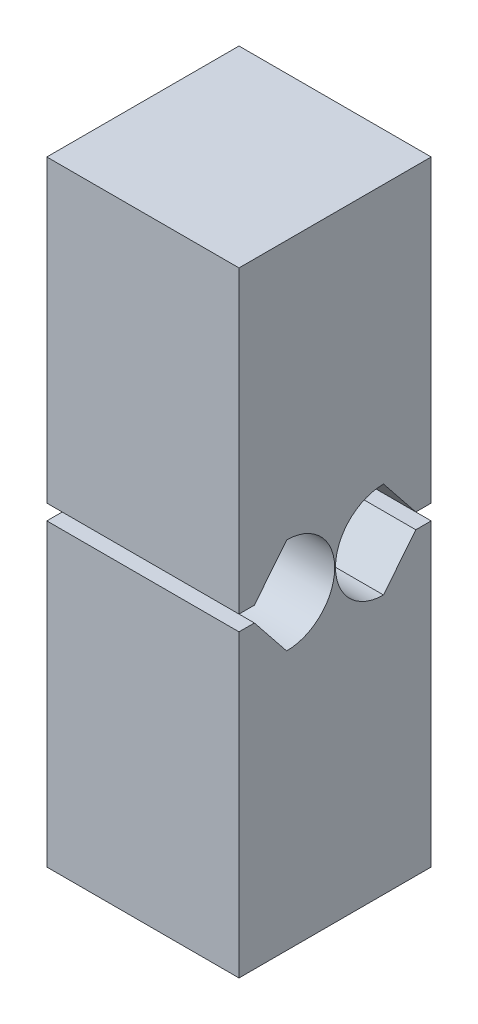
ISO-10303-21;
HEADER;
FILE_DESCRIPTION(('STEP AP214'),'2;1');
FILE_NAME('part.step','',(''),(''),'','','');
FILE_SCHEMA(('AUTOMOTIVE_DESIGN { 1 0 10303 214 1 1 1 1 }'));
ENDSEC;
DATA;
#1=APPLICATION_CONTEXT('core data for automotive mechanical design processes');
#2=APPLICATION_PROTOCOL_DEFINITION('international standard','automotive_design',2000,#1);
#3=PRODUCT_CONTEXT('',#1,'mechanical');
#4=PRODUCT('Part','Part','',(#3));
#5=PRODUCT_RELATED_PRODUCT_CATEGORY('part','',(#4));
#6=PRODUCT_DEFINITION_FORMATION('','',#4);
#7=PRODUCT_DEFINITION_CONTEXT('part definition',#1,'design');
#8=PRODUCT_DEFINITION('design','',#6,#7);
#9=PRODUCT_DEFINITION_SHAPE('','',#8);
#10=(LENGTH_UNIT() NAMED_UNIT(*) SI_UNIT(.MILLI.,.METRE.));
#11=(NAMED_UNIT(*) PLANE_ANGLE_UNIT() SI_UNIT($,.RADIAN.));
#12=(NAMED_UNIT(*) SI_UNIT($,.STERADIAN.) SOLID_ANGLE_UNIT());
#13=UNCERTAINTY_MEASURE_WITH_UNIT(LENGTH_MEASURE(1.E-05),#10,'distance_accuracy_value','');
#14=(GEOMETRIC_REPRESENTATION_CONTEXT(3) GLOBAL_UNCERTAINTY_ASSIGNED_CONTEXT((#13)) GLOBAL_UNIT_ASSIGNED_CONTEXT((#10,
#11,#12)) REPRESENTATION_CONTEXT('',''));
#15=CARTESIAN_POINT('',(0.,0.,0.));
#16=DIRECTION('',(0.,0.,1.));
#17=DIRECTION('',(1.,0.,0.));
#18=AXIS2_PLACEMENT_3D('',#15,#16,#17);
#19=CARTESIAN_POINT('',(-3.175,10.16,-3.175));
#20=DIRECTION('',(1.,0.,0.));
#21=DIRECTION('',(0.,0.,-1.));
#22=AXIS2_PLACEMENT_3D('',#19,#20,#21);
#23=PLANE('',#22);
#24=DIRECTION('',(0.,0.,1.));
#25=VECTOR('',#24,1.);
#26=CARTESIAN_POINT('',(-3.175,0.254,-3.175));
#27=LINE('',#26,#25);
#28=CARTESIAN_POINT('',(-3.175,0.254000000000001,-3.175));
#29=VERTEX_POINT('',#28);
#30=CARTESIAN_POINT('',(-3.175,0.254,-2.667));
#31=VERTEX_POINT('',#30);
#32=EDGE_CURVE('E151',#29,#31,#27,.T.);
#33=ORIENTED_EDGE('',*,*,#32,.T.);
#34=DIRECTION('',(0.,0.78086880944303,0.624695047554424));
#35=VECTOR('',#34,1.);
#36=CARTESIAN_POINT('',(-3.175,0.254,-2.667));
#37=LINE('',#36,#35);
#38=CARTESIAN_POINT('',(-3.175,1.5875,-1.6002));
#39=VERTEX_POINT('',#38);
#40=EDGE_CURVE('E163',#31,#39,#37,.T.);
#41=ORIENTED_EDGE('',*,*,#40,.T.);
#42=CARTESIAN_POINT('',(-3.175,0.,-1.6002));
#43=DIRECTION('',(1.,0.,0.));
#44=DIRECTION('',(0.,0.,-1.));
#45=AXIS2_PLACEMENT_3D('',#42,#43,#44);
#46=CIRCLE('',#45,1.5875);
#47=CARTESIAN_POINT('',(-3.175,-1.5875,-1.6002));
#48=VERTEX_POINT('',#47);
#49=EDGE_CURVE('E332',#39,#48,#46,.T.);
#50=ORIENTED_EDGE('',*,*,#49,.T.);
#51=DIRECTION('',(0.,0.78086880944303,-0.624695047554424));
#52=VECTOR('',#51,1.);
#53=CARTESIAN_POINT('',(-3.175,-0.254,-2.667));
#54=LINE('',#53,#52);
#55=CARTESIAN_POINT('',(-3.175,-0.254,-2.667));
#56=VERTEX_POINT('',#55);
#57=EDGE_CURVE('E299',#48,#56,#54,.T.);
#58=ORIENTED_EDGE('',*,*,#57,.T.);
#59=DIRECTION('',(0.,0.,-1.));
#60=VECTOR('',#59,1.);
#61=CARTESIAN_POINT('',(-3.175,-0.254,-3.175));
#62=LINE('',#61,#60);
#63=CARTESIAN_POINT('',(-3.175,-0.254000000000001,-3.175));
#64=VERTEX_POINT('',#63);
#65=EDGE_CURVE('E336',#56,#64,#62,.T.);
#66=ORIENTED_EDGE('',*,*,#65,.T.);
#67=DIRECTION('',(0.,-1.,0.));
#68=VECTOR('',#67,1.);
#69=CARTESIAN_POINT('',(-3.175,10.16,-3.175));
#70=LINE('',#69,#68);
#71=CARTESIAN_POINT('',(-3.175,-10.16,-3.175));
#72=VERTEX_POINT('',#71);
#73=EDGE_CURVE('E182',#64,#72,#70,.T.);
#74=ORIENTED_EDGE('',*,*,#73,.T.);
#75=DIRECTION('',(0.,0.,1.));
#76=VECTOR('',#75,1.);
#77=CARTESIAN_POINT('',(-3.175,-10.16,-3.175));
#78=LINE('',#77,#76);
#79=CARTESIAN_POINT('',(-3.175,-10.16,3.175));
#80=VERTEX_POINT('',#79);
#81=EDGE_CURVE('E229',#72,#80,#78,.T.);
#82=ORIENTED_EDGE('',*,*,#81,.T.);
#83=DIRECTION('',(0.,-1.,0.));
#84=VECTOR('',#83,1.);
#85=CARTESIAN_POINT('',(-3.175,10.16,3.175));
#86=LINE('',#85,#84);
#87=CARTESIAN_POINT('',(-3.175,-0.254,3.175));
#88=VERTEX_POINT('',#87);
#89=EDGE_CURVE('E46',#88,#80,#86,.T.);
#90=ORIENTED_EDGE('',*,*,#89,.F.);
#91=DIRECTION('',(0.,0.,1.));
#92=VECTOR('',#91,1.);
#93=CARTESIAN_POINT('',(-3.175,-0.254,3.175));
#94=LINE('',#93,#92);
#95=CARTESIAN_POINT('',(-3.175,-0.254,2.667));
#96=VERTEX_POINT('',#95);
#97=EDGE_CURVE('E285',#96,#88,#94,.T.);
#98=ORIENTED_EDGE('',*,*,#97,.F.);
#99=DIRECTION('',(0.,0.78086880944303,0.624695047554424));
#100=VECTOR('',#99,1.);
#101=CARTESIAN_POINT('',(-3.175,-0.254,2.667));
#102=LINE('',#101,#100);
#103=CARTESIAN_POINT('',(-3.175,-1.5875,1.6002));
#104=VERTEX_POINT('',#103);
#105=EDGE_CURVE('E287',#104,#96,#102,.T.);
#106=ORIENTED_EDGE('',*,*,#105,.F.);
#107=CARTESIAN_POINT('',(-3.175,0.,1.6002));
#108=DIRECTION('',(1.,0.,0.));
#109=DIRECTION('',(0.,0.,-1.));
#110=AXIS2_PLACEMENT_3D('',#107,#108,#109);
#111=CIRCLE('',#110,1.5875);
#112=CARTESIAN_POINT('',(-3.175,1.5875,1.6002));
#113=VERTEX_POINT('',#112);
#114=EDGE_CURVE('E291',#113,#104,#111,.F.);
#115=ORIENTED_EDGE('',*,*,#114,.F.);
#116=DIRECTION('',(0.,0.78086880944303,-0.624695047554424));
#117=VECTOR('',#116,1.);
#118=CARTESIAN_POINT('',(-3.175,0.254,2.667));
#119=LINE('',#118,#117);
#120=CARTESIAN_POINT('',(-3.175,0.254,2.667));
#121=VERTEX_POINT('',#120);
#122=EDGE_CURVE('E239',#121,#113,#119,.T.);
#123=ORIENTED_EDGE('',*,*,#122,.F.);
#124=DIRECTION('',(0.,0.,-1.));
#125=VECTOR('',#124,1.);
#126=CARTESIAN_POINT('',(-3.175,0.254,3.175));
#127=LINE('',#126,#125);
#128=CARTESIAN_POINT('',(-3.175,0.254,3.175));
#129=VERTEX_POINT('',#128);
#130=EDGE_CURVE('E295',#129,#121,#127,.T.);
#131=ORIENTED_EDGE('',*,*,#130,.F.);
#132=CARTESIAN_POINT('',(-3.175,10.16,3.175));
#133=VERTEX_POINT('',#132);
#134=EDGE_CURVE('E11',#133,#129,#86,.T.);
#135=ORIENTED_EDGE('',*,*,#134,.F.);
#136=DIRECTION('',(0.,0.,1.));
#137=VECTOR('',#136,1.);
#138=CARTESIAN_POINT('',(-3.175,10.16,-3.175));
#139=LINE('',#138,#137);
#140=CARTESIAN_POINT('',(-3.175,10.16,-3.175));
#141=VERTEX_POINT('',#140);
#142=EDGE_CURVE('E179',#141,#133,#139,.T.);
#143=ORIENTED_EDGE('',*,*,#142,.F.);
#144=EDGE_CURVE('E170',#141,#29,#70,.T.);
#145=ORIENTED_EDGE('',*,*,#144,.T.);
#146=EDGE_LOOP('',(#33,#41,#50,#58,#66,#74,#82,#90,#98,#106,#115,#123,#131,#135,#143,#145));
#147=FACE_BOUND('',#146,.T.);
#148=ADVANCED_FACE('F38',(#147),#23,.F.);
#149=CARTESIAN_POINT('',(3.175,10.16,-3.175));
#150=DIRECTION('',(-1.,0.,0.));
#151=DIRECTION('',(0.,0.,1.));
#152=AXIS2_PLACEMENT_3D('',#149,#150,#151);
#153=PLANE('',#152);
#154=DIRECTION('',(0.,0.,-1.));
#155=VECTOR('',#154,1.);
#156=CARTESIAN_POINT('',(3.175,0.254,-3.175));
#157=LINE('',#156,#155);
#158=CARTESIAN_POINT('',(3.175,0.254,-2.667));
#159=VERTEX_POINT('',#158);
#160=CARTESIAN_POINT('',(3.175,0.254,-3.175));
#161=VERTEX_POINT('',#160);
#162=EDGE_CURVE('E320',#159,#161,#157,.T.);
#163=ORIENTED_EDGE('',*,*,#162,.T.);
#164=DIRECTION('',(0.,-1.,0.));
#165=VECTOR('',#164,1.);
#166=CARTESIAN_POINT('',(3.175,10.16,-3.175));
#167=LINE('',#166,#165);
#168=CARTESIAN_POINT('',(3.175,10.16,-3.175));
#169=VERTEX_POINT('',#168);
#170=EDGE_CURVE('E173',#169,#161,#167,.T.);
#171=ORIENTED_EDGE('',*,*,#170,.F.);
#172=DIRECTION('',(0.,0.,-1.));
#173=VECTOR('',#172,1.);
#174=CARTESIAN_POINT('',(3.175,10.16,-3.175));
#175=LINE('',#174,#173);
#176=CARTESIAN_POINT('',(3.175,10.16,3.175));
#177=VERTEX_POINT('',#176);
#178=EDGE_CURVE('E242',#177,#169,#175,.T.);
#179=ORIENTED_EDGE('',*,*,#178,.F.);
#180=DIRECTION('',(0.,-1.,0.));
#181=VECTOR('',#180,1.);
#182=CARTESIAN_POINT('',(3.175,10.16,3.175));
#183=LINE('',#182,#181);
#184=CARTESIAN_POINT('',(3.175,0.254,3.175));
#185=VERTEX_POINT('',#184);
#186=EDGE_CURVE('E195',#177,#185,#183,.T.);
#187=ORIENTED_EDGE('',*,*,#186,.T.);
#188=DIRECTION('',(0.,0.,1.));
#189=VECTOR('',#188,1.);
#190=CARTESIAN_POINT('',(3.175,0.254,3.175));
#191=LINE('',#190,#189);
#192=CARTESIAN_POINT('',(3.175,0.254,2.667));
#193=VERTEX_POINT('',#192);
#194=EDGE_CURVE('E277',#193,#185,#191,.T.);
#195=ORIENTED_EDGE('',*,*,#194,.F.);
#196=DIRECTION('',(0.,-0.78086880944303,0.624695047554424));
#197=VECTOR('',#196,1.);
#198=CARTESIAN_POINT('',(3.175,0.254,2.667));
#199=LINE('',#198,#197);
#200=CARTESIAN_POINT('',(3.175,1.5875,1.6002));
#201=VERTEX_POINT('',#200);
#202=EDGE_CURVE('E279',#201,#193,#199,.T.);
#203=ORIENTED_EDGE('',*,*,#202,.F.);
#204=CARTESIAN_POINT('',(3.175,0.,1.6002));
#205=DIRECTION('',(1.,0.,0.));
#206=DIRECTION('',(0.,0.,1.));
#207=AXIS2_PLACEMENT_3D('',#204,#205,#206);
#208=CIRCLE('',#207,1.5875);
#209=CARTESIAN_POINT('',(3.175,-1.5875,1.6002));
#210=VERTEX_POINT('',#209);
#211=EDGE_CURVE('E61',#210,#201,#208,.T.);
#212=ORIENTED_EDGE('',*,*,#211,.F.);
#213=DIRECTION('',(0.,-0.78086880944303,-0.624695047554424));
#214=VECTOR('',#213,1.);
#215=CARTESIAN_POINT('',(3.175,-0.254,2.667));
#216=LINE('',#215,#214);
#217=CARTESIAN_POINT('',(3.175,-0.254,2.667));
#218=VERTEX_POINT('',#217);
#219=EDGE_CURVE('E258',#218,#210,#216,.T.);
#220=ORIENTED_EDGE('',*,*,#219,.F.);
#221=DIRECTION('',(0.,0.,-1.));
#222=VECTOR('',#221,1.);
#223=CARTESIAN_POINT('',(3.175,-0.254,3.175));
#224=LINE('',#223,#222);
#225=CARTESIAN_POINT('',(3.175,-0.254,3.175));
#226=VERTEX_POINT('',#225);
#227=EDGE_CURVE('E218',#226,#218,#224,.T.);
#228=ORIENTED_EDGE('',*,*,#227,.F.);
#229=CARTESIAN_POINT('',(3.175,-10.16,3.175));
#230=VERTEX_POINT('',#229);
#231=EDGE_CURVE('E194',#226,#230,#183,.T.);
#232=ORIENTED_EDGE('',*,*,#231,.T.);
#233=DIRECTION('',(0.,0.,-1.));
#234=VECTOR('',#233,1.);
#235=CARTESIAN_POINT('',(3.175,-10.16,-3.175));
#236=LINE('',#235,#234);
#237=CARTESIAN_POINT('',(3.175,-10.16,-3.175));
#238=VERTEX_POINT('',#237);
#239=EDGE_CURVE('E214',#230,#238,#236,.T.);
#240=ORIENTED_EDGE('',*,*,#239,.T.);
#241=CARTESIAN_POINT('',(3.175,-0.254000000000001,-3.175));
#242=VERTEX_POINT('',#241);
#243=EDGE_CURVE('E181',#242,#238,#167,.T.);
#244=ORIENTED_EDGE('',*,*,#243,.F.);
#245=DIRECTION('',(0.,0.,1.));
#246=VECTOR('',#245,1.);
#247=CARTESIAN_POINT('',(3.175,-0.254,-3.175));
#248=LINE('',#247,#246);
#249=CARTESIAN_POINT('',(3.175,-0.254,-2.667));
#250=VERTEX_POINT('',#249);
#251=EDGE_CURVE('E53',#242,#250,#248,.T.);
#252=ORIENTED_EDGE('',*,*,#251,.T.);
#253=DIRECTION('',(0.,-0.78086880944303,0.624695047554424));
#254=VECTOR('',#253,1.);
#255=CARTESIAN_POINT('',(3.175,-0.254,-2.667));
#256=LINE('',#255,#254);
#257=CARTESIAN_POINT('',(3.175,-1.5875,-1.6002));
#258=VERTEX_POINT('',#257);
#259=EDGE_CURVE('E324',#250,#258,#256,.T.);
#260=ORIENTED_EDGE('',*,*,#259,.T.);
#261=CARTESIAN_POINT('',(3.175,0.,-1.6002));
#262=DIRECTION('',(-1.,0.,0.));
#263=DIRECTION('',(0.,0.,-1.));
#264=AXIS2_PLACEMENT_3D('',#261,#262,#263);
#265=CIRCLE('',#264,1.5875);
#266=CARTESIAN_POINT('',(3.175,1.5875,-1.6002));
#267=VERTEX_POINT('',#266);
#268=EDGE_CURVE('E162',#258,#267,#265,.T.);
#269=ORIENTED_EDGE('',*,*,#268,.T.);
#270=DIRECTION('',(0.,-0.78086880944303,-0.624695047554424));
#271=VECTOR('',#270,1.);
#272=CARTESIAN_POINT('',(3.175,0.254,-2.667));
#273=LINE('',#272,#271);
#274=EDGE_CURVE('E308',#267,#159,#273,.T.);
#275=ORIENTED_EDGE('',*,*,#274,.T.);
#276=EDGE_LOOP('',(#163,#171,#179,#187,#195,#203,#212,#220,#228,#232,#240,#244,#252,#260,#269,#275));
#277=FACE_BOUND('',#276,.T.);
#278=ADVANCED_FACE('F211',(#277),#153,.F.);
#279=CARTESIAN_POINT('',(-3.175,10.16,-3.175));
#280=DIRECTION('',(0.,0.,1.));
#281=DIRECTION('',(1.,0.,0.));
#282=AXIS2_PLACEMENT_3D('',#279,#280,#281);
#283=PLANE('',#282);
#284=DIRECTION('',(1.,0.,0.));
#285=VECTOR('',#284,1.);
#286=CARTESIAN_POINT('',(-3.176,0.254,-3.175));
#287=LINE('',#286,#285);
#288=EDGE_CURVE('E155',#29,#161,#287,.T.);
#289=ORIENTED_EDGE('',*,*,#288,.F.);
#290=ORIENTED_EDGE('',*,*,#144,.F.);
#291=DIRECTION('',(-1.,0.,0.));
#292=VECTOR('',#291,1.);
#293=CARTESIAN_POINT('',(-3.175,10.16,-3.175));
#294=LINE('',#293,#292);
#295=EDGE_CURVE('E189',#169,#141,#294,.T.);
#296=ORIENTED_EDGE('',*,*,#295,.F.);
#297=ORIENTED_EDGE('',*,*,#170,.T.);
#298=EDGE_LOOP('',(#289,#290,#296,#297));
#299=FACE_BOUND('',#298,.T.);
#300=ADVANCED_FACE('F168',(#299),#283,.F.);
#301=DIRECTION('',(1.,0.,0.));
#302=VECTOR('',#301,1.);
#303=CARTESIAN_POINT('',(-3.176,-0.254,-3.175));
#304=LINE('',#303,#302);
#305=EDGE_CURVE('E175',#64,#242,#304,.T.);
#306=ORIENTED_EDGE('',*,*,#305,.T.);
#307=ORIENTED_EDGE('',*,*,#243,.T.);
#308=DIRECTION('',(-1.,0.,0.));
#309=VECTOR('',#308,1.);
#310=CARTESIAN_POINT('',(-3.175,-10.16,-3.175));
#311=LINE('',#310,#309);
#312=EDGE_CURVE('E191',#238,#72,#311,.T.);
#313=ORIENTED_EDGE('',*,*,#312,.T.);
#314=ORIENTED_EDGE('',*,*,#73,.F.);
#315=EDGE_LOOP('',(#306,#307,#313,#314));
#316=FACE_BOUND('',#315,.T.);
#317=ADVANCED_FACE('F341',(#316),#283,.F.);
#318=CARTESIAN_POINT('',(-3.175,10.16,3.175));
#319=DIRECTION('',(0.,0.,-1.));
#320=DIRECTION('',(-1.,0.,0.));
#321=AXIS2_PLACEMENT_3D('',#318,#319,#320);
#322=PLANE('',#321);
#323=ORIENTED_EDGE('',*,*,#231,.F.);
#324=DIRECTION('',(1.,0.,0.));
#325=VECTOR('',#324,1.);
#326=CARTESIAN_POINT('',(-3.176,-0.254,3.175));
#327=LINE('',#326,#325);
#328=EDGE_CURVE('E265',#88,#226,#327,.T.);
#329=ORIENTED_EDGE('',*,*,#328,.F.);
#330=ORIENTED_EDGE('',*,*,#89,.T.);
#331=DIRECTION('',(1.,0.,0.));
#332=VECTOR('',#331,1.);
#333=CARTESIAN_POINT('',(-3.175,-10.16,3.175));
#334=LINE('',#333,#332);
#335=EDGE_CURVE('E222',#80,#230,#334,.T.);
#336=ORIENTED_EDGE('',*,*,#335,.T.);
#337=EDGE_LOOP('',(#323,#329,#330,#336));
#338=FACE_BOUND('',#337,.T.);
#339=ADVANCED_FACE('F223',(#338),#322,.F.);
#340=ORIENTED_EDGE('',*,*,#134,.T.);
#341=DIRECTION('',(1.,0.,0.));
#342=VECTOR('',#341,1.);
#343=CARTESIAN_POINT('',(-3.176,0.254,3.175));
#344=LINE('',#343,#342);
#345=EDGE_CURVE('E261',#129,#185,#344,.T.);
#346=ORIENTED_EDGE('',*,*,#345,.T.);
#347=ORIENTED_EDGE('',*,*,#186,.F.);
#348=DIRECTION('',(1.,0.,0.));
#349=VECTOR('',#348,1.);
#350=CARTESIAN_POINT('',(-3.175,10.16,3.175));
#351=LINE('',#350,#349);
#352=EDGE_CURVE('E245',#133,#177,#351,.T.);
#353=ORIENTED_EDGE('',*,*,#352,.F.);
#354=EDGE_LOOP('',(#340,#346,#347,#353));
#355=FACE_BOUND('',#354,.T.);
#356=ADVANCED_FACE('F358',(#355),#322,.F.);
#357=CARTESIAN_POINT('',(0.,10.16,0.));
#358=DIRECTION('',(0.,1.,0.));
#359=DIRECTION('',(0.,0.,1.));
#360=AXIS2_PLACEMENT_3D('',#357,#358,#359);
#361=PLANE('',#360);
#362=ORIENTED_EDGE('',*,*,#142,.T.);
#363=ORIENTED_EDGE('',*,*,#352,.T.);
#364=ORIENTED_EDGE('',*,*,#178,.T.);
#365=ORIENTED_EDGE('',*,*,#295,.T.);
#366=EDGE_LOOP('',(#362,#363,#364,#365));
#367=FACE_BOUND('',#366,.T.);
#368=ADVANCED_FACE('F360',(#367),#361,.T.);
#369=CARTESIAN_POINT('',(0.,-10.16,0.));
#370=DIRECTION('',(0.,1.,0.));
#371=DIRECTION('',(0.,0.,1.));
#372=AXIS2_PLACEMENT_3D('',#369,#370,#371);
#373=PLANE('',#372);
#374=ORIENTED_EDGE('',*,*,#81,.F.);
#375=ORIENTED_EDGE('',*,*,#312,.F.);
#376=ORIENTED_EDGE('',*,*,#239,.F.);
#377=ORIENTED_EDGE('',*,*,#335,.F.);
#378=EDGE_LOOP('',(#374,#375,#376,#377));
#379=FACE_BOUND('',#378,.T.);
#380=ADVANCED_FACE('F231',(#379),#373,.F.);
#381=CARTESIAN_POINT('',(-3.176,0.,1.6002));
#382=DIRECTION('',(1.,0.,0.));
#383=DIRECTION('',(0.,0.,-1.));
#384=AXIS2_PLACEMENT_3D('',#381,#382,#383);
#385=CYLINDRICAL_SURFACE('',#384,1.5875);
#386=ORIENTED_EDGE('',*,*,#114,.T.);
#387=DIRECTION('',(1.,0.,0.));
#388=VECTOR('',#387,1.);
#389=CARTESIAN_POINT('',(-3.176,-1.5875,1.6002));
#390=LINE('',#389,#388);
#391=EDGE_CURVE('E253',#104,#210,#390,.T.);
#392=ORIENTED_EDGE('',*,*,#391,.T.);
#393=ORIENTED_EDGE('',*,*,#211,.T.);
#394=DIRECTION('',(1.,0.,0.));
#395=VECTOR('',#394,1.);
#396=CARTESIAN_POINT('',(-3.176,1.5875,1.6002));
#397=LINE('',#396,#395);
#398=EDGE_CURVE('E254',#113,#201,#397,.T.);
#399=ORIENTED_EDGE('',*,*,#398,.F.);
#400=EDGE_LOOP('',(#386,#392,#393,#399));
#401=FACE_BOUND('',#400,.T.);
#402=ADVANCED_FACE('F349',(#401),#385,.F.);
#403=CARTESIAN_POINT('',(-3.176,-0.254,2.667));
#404=DIRECTION('',(0.,-0.624695047554424,0.78086880944303));
#405=DIRECTION('',(0.,-0.78086880944303,-0.624695047554424));
#406=AXIS2_PLACEMENT_3D('',#403,#404,#405);
#407=PLANE('',#406);
#408=ORIENTED_EDGE('',*,*,#105,.T.);
#409=DIRECTION('',(1.,0.,0.));
#410=VECTOR('',#409,1.);
#411=CARTESIAN_POINT('',(-3.176,-0.254,2.667));
#412=LINE('',#411,#410);
#413=EDGE_CURVE('E268',#96,#218,#412,.T.);
#414=ORIENTED_EDGE('',*,*,#413,.T.);
#415=ORIENTED_EDGE('',*,*,#219,.T.);
#416=ORIENTED_EDGE('',*,*,#391,.F.);
#417=EDGE_LOOP('',(#408,#414,#415,#416));
#418=FACE_BOUND('',#417,.T.);
#419=ADVANCED_FACE('F348',(#418),#407,.F.);
#420=CARTESIAN_POINT('',(-3.176,-0.254,3.175));
#421=DIRECTION('',(0.,-1.,0.));
#422=DIRECTION('',(0.,0.,-1.));
#423=AXIS2_PLACEMENT_3D('',#420,#421,#422);
#424=PLANE('',#423);
#425=ORIENTED_EDGE('',*,*,#97,.T.);
#426=ORIENTED_EDGE('',*,*,#328,.T.);
#427=ORIENTED_EDGE('',*,*,#227,.T.);
#428=ORIENTED_EDGE('',*,*,#413,.F.);
#429=EDGE_LOOP('',(#425,#426,#427,#428));
#430=FACE_BOUND('',#429,.T.);
#431=ADVANCED_FACE('F346',(#430),#424,.F.);
#432=CARTESIAN_POINT('',(-3.176,0.254,3.175));
#433=DIRECTION('',(0.,1.,0.));
#434=DIRECTION('',(0.,0.,1.));
#435=AXIS2_PLACEMENT_3D('',#432,#433,#434);
#436=PLANE('',#435);
#437=ORIENTED_EDGE('',*,*,#130,.T.);
#438=DIRECTION('',(1.,0.,0.));
#439=VECTOR('',#438,1.);
#440=CARTESIAN_POINT('',(-3.176,0.254,2.667));
#441=LINE('',#440,#439);
#442=EDGE_CURVE('E257',#121,#193,#441,.T.);
#443=ORIENTED_EDGE('',*,*,#442,.T.);
#444=ORIENTED_EDGE('',*,*,#194,.T.);
#445=ORIENTED_EDGE('',*,*,#345,.F.);
#446=EDGE_LOOP('',(#437,#443,#444,#445));
#447=FACE_BOUND('',#446,.T.);
#448=ADVANCED_FACE('F356',(#447),#436,.F.);
#449=CARTESIAN_POINT('',(-3.176,0.254,2.667));
#450=DIRECTION('',(0.,0.624695047554424,0.78086880944303));
#451=DIRECTION('',(0.,-0.78086880944303,0.624695047554424));
#452=AXIS2_PLACEMENT_3D('',#449,#450,#451);
#453=PLANE('',#452);
#454=ORIENTED_EDGE('',*,*,#122,.T.);
#455=ORIENTED_EDGE('',*,*,#398,.T.);
#456=ORIENTED_EDGE('',*,*,#202,.T.);
#457=ORIENTED_EDGE('',*,*,#442,.F.);
#458=EDGE_LOOP('',(#454,#455,#456,#457));
#459=FACE_BOUND('',#458,.T.);
#460=ADVANCED_FACE('F353',(#459),#453,.F.);
#461=CARTESIAN_POINT('',(-3.176,0.,-1.6002));
#462=DIRECTION('',(1.,0.,0.));
#463=DIRECTION('',(0.,0.,-1.));
#464=AXIS2_PLACEMENT_3D('',#461,#462,#463);
#465=CYLINDRICAL_SURFACE('',#464,1.5875);
#466=DIRECTION('',(1.,0.,0.));
#467=VECTOR('',#466,1.);
#468=CARTESIAN_POINT('',(-3.176,1.5875,-1.6002));
#469=LINE('',#468,#467);
#470=EDGE_CURVE('E303',#39,#267,#469,.T.);
#471=ORIENTED_EDGE('',*,*,#470,.T.);
#472=ORIENTED_EDGE('',*,*,#268,.F.);
#473=DIRECTION('',(1.,0.,0.));
#474=VECTOR('',#473,1.);
#475=CARTESIAN_POINT('',(-3.176,-1.5875,-1.6002));
#476=LINE('',#475,#474);
#477=EDGE_CURVE('E304',#48,#258,#476,.T.);
#478=ORIENTED_EDGE('',*,*,#477,.F.);
#479=ORIENTED_EDGE('',*,*,#49,.F.);
#480=EDGE_LOOP('',(#471,#472,#478,#479));
#481=FACE_BOUND('',#480,.T.);
#482=ADVANCED_FACE('F368',(#481),#465,.F.);
#483=CARTESIAN_POINT('',(-3.176,0.254,-2.667));
#484=DIRECTION('',(0.,-0.624695047554424,0.78086880944303));
#485=DIRECTION('',(0.,-0.78086880944303,-0.624695047554424));
#486=AXIS2_PLACEMENT_3D('',#483,#484,#485);
#487=PLANE('',#486);
#488=DIRECTION('',(1.,0.,0.));
#489=VECTOR('',#488,1.);
#490=CARTESIAN_POINT('',(-3.176,0.254,-2.667));
#491=LINE('',#490,#489);
#492=EDGE_CURVE('E157',#31,#159,#491,.T.);
#493=ORIENTED_EDGE('',*,*,#492,.T.);
#494=ORIENTED_EDGE('',*,*,#274,.F.);
#495=ORIENTED_EDGE('',*,*,#470,.F.);
#496=ORIENTED_EDGE('',*,*,#40,.F.);
#497=EDGE_LOOP('',(#493,#494,#495,#496));
#498=FACE_BOUND('',#497,.T.);
#499=ADVANCED_FACE('F365',(#498),#487,.T.);
#500=CARTESIAN_POINT('',(-3.176,0.254,-3.175));
#501=DIRECTION('',(0.,-1.,0.));
#502=DIRECTION('',(0.,0.,-1.));
#503=AXIS2_PLACEMENT_3D('',#500,#501,#502);
#504=PLANE('',#503);
#505=ORIENTED_EDGE('',*,*,#288,.T.);
#506=ORIENTED_EDGE('',*,*,#162,.F.);
#507=ORIENTED_EDGE('',*,*,#492,.F.);
#508=ORIENTED_EDGE('',*,*,#32,.F.);
#509=EDGE_LOOP('',(#505,#506,#507,#508));
#510=FACE_BOUND('',#509,.T.);
#511=ADVANCED_FACE('F153',(#510),#504,.T.);
#512=CARTESIAN_POINT('',(-3.176,-0.254,-3.175));
#513=DIRECTION('',(0.,1.,0.));
#514=DIRECTION('',(0.,0.,1.));
#515=AXIS2_PLACEMENT_3D('',#512,#513,#514);
#516=PLANE('',#515);
#517=DIRECTION('',(1.,0.,0.));
#518=VECTOR('',#517,1.);
#519=CARTESIAN_POINT('',(-3.176,-0.254,-2.667));
#520=LINE('',#519,#518);
#521=EDGE_CURVE('E307',#56,#250,#520,.T.);
#522=ORIENTED_EDGE('',*,*,#521,.T.);
#523=ORIENTED_EDGE('',*,*,#251,.F.);
#524=ORIENTED_EDGE('',*,*,#305,.F.);
#525=ORIENTED_EDGE('',*,*,#65,.F.);
#526=EDGE_LOOP('',(#522,#523,#524,#525));
#527=FACE_BOUND('',#526,.T.);
#528=ADVANCED_FACE('F372',(#527),#516,.T.);
#529=CARTESIAN_POINT('',(-3.176,-0.254,-2.667));
#530=DIRECTION('',(0.,0.624695047554424,0.78086880944303));
#531=DIRECTION('',(0.,-0.78086880944303,0.624695047554424));
#532=AXIS2_PLACEMENT_3D('',#529,#530,#531);
#533=PLANE('',#532);
#534=ORIENTED_EDGE('',*,*,#477,.T.);
#535=ORIENTED_EDGE('',*,*,#259,.F.);
#536=ORIENTED_EDGE('',*,*,#521,.F.);
#537=ORIENTED_EDGE('',*,*,#57,.F.);
#538=EDGE_LOOP('',(#534,#535,#536,#537));
#539=FACE_BOUND('',#538,.T.);
#540=ADVANCED_FACE('F371',(#539),#533,.T.);
#541=CLOSED_SHELL('',(#148,#278,#300,#317,#339,#356,#368,#380,#402,#419,#431,#448,#460,#482,
#499,#511,#528,#540));
#542=MANIFOLD_SOLID_BREP('B2',#541);
#543=ADVANCED_BREP_SHAPE_REPRESENTATION('',(#18,#542),#14);
#544=SHAPE_DEFINITION_REPRESENTATION(#9,#543);
ENDSEC;
END-ISO-10303-21;
